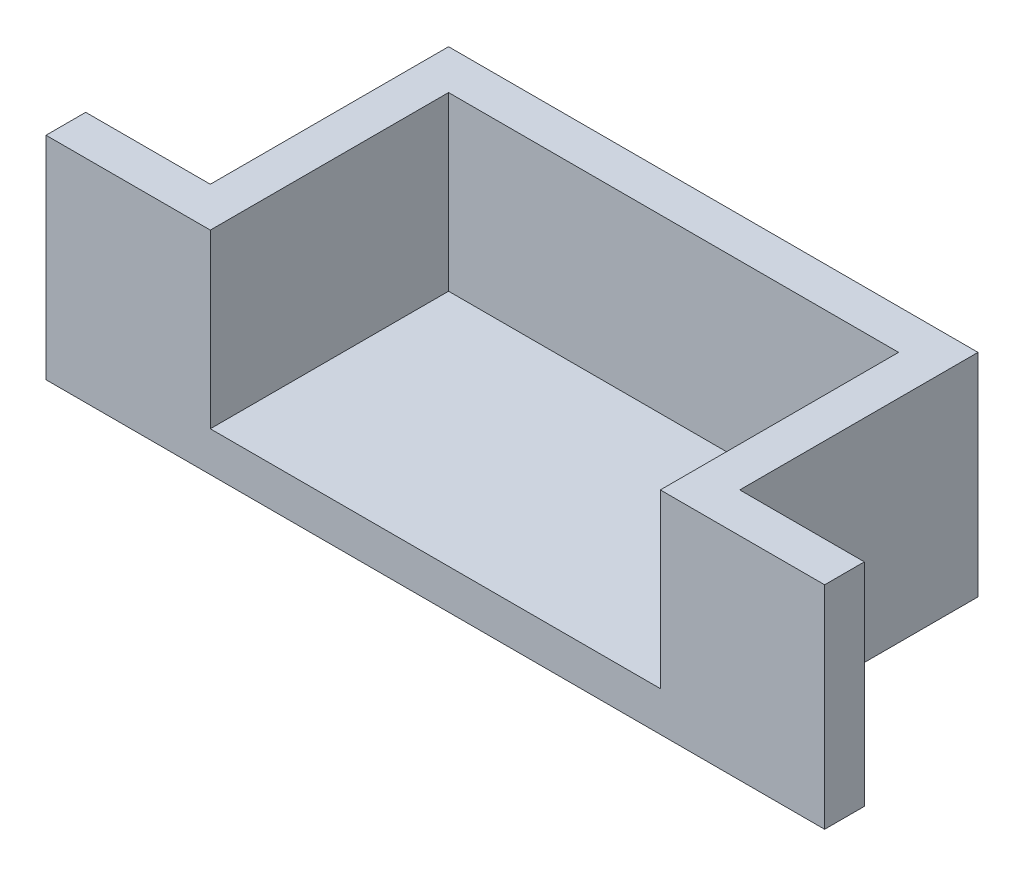
ISO-10303-21;
HEADER;
FILE_DESCRIPTION(('STEP AP214'),'2;1');
FILE_NAME('part.step','',(''),(''),'','','');
FILE_SCHEMA(('AUTOMOTIVE_DESIGN { 1 0 10303 214 1 1 1 1 }'));
ENDSEC;
DATA;
#1=APPLICATION_CONTEXT('core data for automotive mechanical design processes');
#2=APPLICATION_PROTOCOL_DEFINITION('international standard','automotive_design',2000,#1);
#3=PRODUCT_CONTEXT('',#1,'mechanical');
#4=PRODUCT('Part','Part','',(#3));
#5=PRODUCT_RELATED_PRODUCT_CATEGORY('part','',(#4));
#6=PRODUCT_DEFINITION_FORMATION('','',#4);
#7=PRODUCT_DEFINITION_CONTEXT('part definition',#1,'design');
#8=PRODUCT_DEFINITION('design','',#6,#7);
#9=PRODUCT_DEFINITION_SHAPE('','',#8);
#10=(LENGTH_UNIT() NAMED_UNIT(*) SI_UNIT(.MILLI.,.METRE.));
#11=(NAMED_UNIT(*) PLANE_ANGLE_UNIT() SI_UNIT($,.RADIAN.));
#12=(NAMED_UNIT(*) SI_UNIT($,.STERADIAN.) SOLID_ANGLE_UNIT());
#13=UNCERTAINTY_MEASURE_WITH_UNIT(LENGTH_MEASURE(1.E-05),#10,'distance_accuracy_value','');
#14=(GEOMETRIC_REPRESENTATION_CONTEXT(3) GLOBAL_UNCERTAINTY_ASSIGNED_CONTEXT((#13)) GLOBAL_UNIT_ASSIGNED_CONTEXT((#10,
#11,#12)) REPRESENTATION_CONTEXT('',''));
#15=CARTESIAN_POINT('',(0.,0.,0.));
#16=DIRECTION('',(0.,0.,1.));
#17=DIRECTION('',(1.,0.,0.));
#18=AXIS2_PLACEMENT_3D('',#15,#16,#17);
#19=CARTESIAN_POINT('',(-17.,16.,0.));
#20=DIRECTION('',(1.,0.,0.));
#21=DIRECTION('',(0.,0.,-1.));
#22=AXIS2_PLACEMENT_3D('',#19,#20,#21);
#23=PLANE('',#22);
#24=DIRECTION('',(0.,0.,1.));
#25=VECTOR('',#24,1.);
#26=CARTESIAN_POINT('',(-17.,3.,-4.94252873563218));
#27=LINE('',#26,#25);
#28=CARTESIAN_POINT('',(-17.,3.,-4.94252873563218));
#29=VERTEX_POINT('',#28);
#30=CARTESIAN_POINT('',(-17.,3.,13.0574712643678));
#31=VERTEX_POINT('',#30);
#32=EDGE_CURVE('E59',#29,#31,#27,.T.);
#33=ORIENTED_EDGE('',*,*,#32,.F.);
#34=DIRECTION('',(0.,-1.,0.));
#35=VECTOR('',#34,1.);
#36=CARTESIAN_POINT('',(-17.,16.,-4.94252873563218));
#37=LINE('',#36,#35);
#38=CARTESIAN_POINT('',(-17.,16.,-4.94252873563218));
#39=VERTEX_POINT('',#38);
#40=EDGE_CURVE('E11',#39,#29,#37,.T.);
#41=ORIENTED_EDGE('',*,*,#40,.F.);
#42=DIRECTION('',(0.,0.,1.));
#43=VECTOR('',#42,1.);
#44=CARTESIAN_POINT('',(-17.,16.,0.));
#45=LINE('',#44,#43);
#46=CARTESIAN_POINT('',(-17.,16.,13.0574712643678));
#47=VERTEX_POINT('',#46);
#48=EDGE_CURVE('E133',#39,#47,#45,.T.);
#49=ORIENTED_EDGE('',*,*,#48,.T.);
#50=DIRECTION('',(0.,-1.,0.));
#51=VECTOR('',#50,1.);
#52=CARTESIAN_POINT('',(-17.,16.,13.0574712643678));
#53=LINE('',#52,#51);
#54=EDGE_CURVE('E174',#47,#31,#53,.T.);
#55=ORIENTED_EDGE('',*,*,#54,.T.);
#56=EDGE_LOOP('',(#33,#41,#49,#55));
#57=FACE_BOUND('',#56,.T.);
#58=ADVANCED_FACE('F45',(#57),#23,.T.);
#59=CARTESIAN_POINT('',(0.,16.,-4.94252873563218));
#60=DIRECTION('',(0.,0.,-1.));
#61=DIRECTION('',(-1.,0.,0.));
#62=AXIS2_PLACEMENT_3D('',#59,#60,#61);
#63=PLANE('',#62);
#64=ORIENTED_EDGE('',*,*,#40,.T.);
#65=DIRECTION('',(-1.,0.,0.));
#66=VECTOR('',#65,1.);
#67=CARTESIAN_POINT('',(-17.,3.,-4.94252873563218));
#68=LINE('',#67,#66);
#69=CARTESIAN_POINT('',(17.,3.,-4.94252873563218));
#70=VERTEX_POINT('',#69);
#71=EDGE_CURVE('E65',#70,#29,#68,.T.);
#72=ORIENTED_EDGE('',*,*,#71,.F.);
#73=DIRECTION('',(0.,-1.,0.));
#74=VECTOR('',#73,1.);
#75=CARTESIAN_POINT('',(17.,16.,-4.94252873563218));
#76=LINE('',#75,#74);
#77=CARTESIAN_POINT('',(17.,16.,-4.94252873563218));
#78=VERTEX_POINT('',#77);
#79=EDGE_CURVE('E52',#78,#70,#76,.T.);
#80=ORIENTED_EDGE('',*,*,#79,.F.);
#81=DIRECTION('',(1.,0.,0.));
#82=VECTOR('',#81,1.);
#83=CARTESIAN_POINT('',(0.,16.,-4.94252873563218));
#84=LINE('',#83,#82);
#85=EDGE_CURVE('E135',#39,#78,#84,.T.);
#86=ORIENTED_EDGE('',*,*,#85,.F.);
#87=EDGE_LOOP('',(#64,#72,#80,#86));
#88=FACE_BOUND('',#87,.T.);
#89=ADVANCED_FACE('F136',(#88),#63,.F.);
#90=CARTESIAN_POINT('',(17.,16.,0.));
#91=DIRECTION('',(1.,0.,0.));
#92=DIRECTION('',(0.,0.,-1.));
#93=AXIS2_PLACEMENT_3D('',#90,#91,#92);
#94=PLANE('',#93);
#95=ORIENTED_EDGE('',*,*,#79,.T.);
#96=DIRECTION('',(0.,0.,-1.));
#97=VECTOR('',#96,1.);
#98=CARTESIAN_POINT('',(17.,3.,-4.94252873563218));
#99=LINE('',#98,#97);
#100=CARTESIAN_POINT('',(17.,3.,13.0574712643678));
#101=VERTEX_POINT('',#100);
#102=EDGE_CURVE('E219',#101,#70,#99,.T.);
#103=ORIENTED_EDGE('',*,*,#102,.F.);
#104=DIRECTION('',(0.,-1.,0.));
#105=VECTOR('',#104,1.);
#106=CARTESIAN_POINT('',(17.,16.,13.0574712643678));
#107=LINE('',#106,#105);
#108=CARTESIAN_POINT('',(17.,16.,13.0574712643678));
#109=VERTEX_POINT('',#108);
#110=EDGE_CURVE('E213',#109,#101,#107,.T.);
#111=ORIENTED_EDGE('',*,*,#110,.F.);
#112=DIRECTION('',(0.,0.,1.));
#113=VECTOR('',#112,1.);
#114=CARTESIAN_POINT('',(17.,16.,0.));
#115=LINE('',#114,#113);
#116=EDGE_CURVE('E139',#78,#109,#115,.T.);
#117=ORIENTED_EDGE('',*,*,#116,.F.);
#118=EDGE_LOOP('',(#95,#103,#111,#117));
#119=FACE_BOUND('',#118,.T.);
#120=ADVANCED_FACE('F217',(#119),#94,.F.);
#121=CARTESIAN_POINT('',(29.4137931034483,16.,0.));
#122=DIRECTION('',(1.,0.,0.));
#123=DIRECTION('',(0.,0.,-1.));
#124=AXIS2_PLACEMENT_3D('',#121,#122,#123);
#125=PLANE('',#124);
#126=DIRECTION('',(0.,0.,1.));
#127=VECTOR('',#126,1.);
#128=CARTESIAN_POINT('',(29.4137931034483,0.,0.));
#129=LINE('',#128,#127);
#130=CARTESIAN_POINT('',(29.4137931034483,0.,10.0574712643678));
#131=VERTEX_POINT('',#130);
#132=CARTESIAN_POINT('',(29.4137931034483,0.,13.0574712643678));
#133=VERTEX_POINT('',#132);
#134=EDGE_CURVE('E175',#131,#133,#129,.T.);
#135=ORIENTED_EDGE('',*,*,#134,.F.);
#136=DIRECTION('',(0.,-1.,0.));
#137=VECTOR('',#136,1.);
#138=CARTESIAN_POINT('',(29.4137931034483,16.,10.0574712643678));
#139=LINE('',#138,#137);
#140=CARTESIAN_POINT('',(29.4137931034483,16.,10.0574712643678));
#141=VERTEX_POINT('',#140);
#142=EDGE_CURVE('E208',#141,#131,#139,.T.);
#143=ORIENTED_EDGE('',*,*,#142,.F.);
#144=DIRECTION('',(0.,0.,1.));
#145=VECTOR('',#144,1.);
#146=CARTESIAN_POINT('',(29.4137931034483,16.,0.));
#147=LINE('',#146,#145);
#148=CARTESIAN_POINT('',(29.4137931034483,16.,13.0574712643678));
#149=VERTEX_POINT('',#148);
#150=EDGE_CURVE('E155',#141,#149,#147,.T.);
#151=ORIENTED_EDGE('',*,*,#150,.T.);
#152=DIRECTION('',(0.,-1.,0.));
#153=VECTOR('',#152,1.);
#154=CARTESIAN_POINT('',(29.4137931034483,16.,13.0574712643678));
#155=LINE('',#154,#153);
#156=EDGE_CURVE('E210',#149,#133,#155,.T.);
#157=ORIENTED_EDGE('',*,*,#156,.T.);
#158=EDGE_LOOP('',(#135,#143,#151,#157));
#159=FACE_BOUND('',#158,.T.);
#160=ADVANCED_FACE('F262',(#159),#125,.T.);
#161=CARTESIAN_POINT('',(0.,16.,10.0574712643678));
#162=DIRECTION('',(0.,0.,-1.));
#163=DIRECTION('',(-1.,0.,0.));
#164=AXIS2_PLACEMENT_3D('',#161,#162,#163);
#165=PLANE('',#164);
#166=DIRECTION('',(1.,0.,0.));
#167=VECTOR('',#166,1.);
#168=CARTESIAN_POINT('',(0.,0.,10.0574712643678));
#169=LINE('',#168,#167);
#170=CARTESIAN_POINT('',(20.,0.,10.0574712643678));
#171=VERTEX_POINT('',#170);
#172=EDGE_CURVE('E178',#171,#131,#169,.T.);
#173=ORIENTED_EDGE('',*,*,#172,.F.);
#174=DIRECTION('',(0.,-1.,0.));
#175=VECTOR('',#174,1.);
#176=CARTESIAN_POINT('',(20.,16.,10.0574712643678));
#177=LINE('',#176,#175);
#178=CARTESIAN_POINT('',(20.,16.,10.0574712643678));
#179=VERTEX_POINT('',#178);
#180=EDGE_CURVE('E206',#179,#171,#177,.T.);
#181=ORIENTED_EDGE('',*,*,#180,.F.);
#182=DIRECTION('',(1.,0.,0.));
#183=VECTOR('',#182,1.);
#184=CARTESIAN_POINT('',(0.,16.,10.0574712643678));
#185=LINE('',#184,#183);
#186=EDGE_CURVE('E158',#179,#141,#185,.T.);
#187=ORIENTED_EDGE('',*,*,#186,.T.);
#188=ORIENTED_EDGE('',*,*,#142,.T.);
#189=EDGE_LOOP('',(#173,#181,#187,#188));
#190=FACE_BOUND('',#189,.T.);
#191=ADVANCED_FACE('F237',(#190),#165,.T.);
#192=CARTESIAN_POINT('',(20.,16.,0.));
#193=DIRECTION('',(1.,0.,0.));
#194=DIRECTION('',(0.,0.,-1.));
#195=AXIS2_PLACEMENT_3D('',#192,#193,#194);
#196=PLANE('',#195);
#197=DIRECTION('',(0.,0.,1.));
#198=VECTOR('',#197,1.);
#199=CARTESIAN_POINT('',(20.,0.,0.));
#200=LINE('',#199,#198);
#201=CARTESIAN_POINT('',(20.,0.,-7.94252873563218));
#202=VERTEX_POINT('',#201);
#203=EDGE_CURVE('E181',#202,#171,#200,.T.);
#204=ORIENTED_EDGE('',*,*,#203,.F.);
#205=DIRECTION('',(0.,-1.,0.));
#206=VECTOR('',#205,1.);
#207=CARTESIAN_POINT('',(20.,16.,-7.94252873563218));
#208=LINE('',#207,#206);
#209=CARTESIAN_POINT('',(20.,16.,-7.94252873563218));
#210=VERTEX_POINT('',#209);
#211=EDGE_CURVE('E204',#210,#202,#208,.T.);
#212=ORIENTED_EDGE('',*,*,#211,.F.);
#213=DIRECTION('',(0.,0.,1.));
#214=VECTOR('',#213,1.);
#215=CARTESIAN_POINT('',(20.,16.,0.));
#216=LINE('',#215,#214);
#217=EDGE_CURVE('E161',#210,#179,#216,.T.);
#218=ORIENTED_EDGE('',*,*,#217,.T.);
#219=ORIENTED_EDGE('',*,*,#180,.T.);
#220=EDGE_LOOP('',(#204,#212,#218,#219));
#221=FACE_BOUND('',#220,.T.);
#222=ADVANCED_FACE('F241',(#221),#196,.T.);
#223=CARTESIAN_POINT('',(0.,16.,-7.94252873563218));
#224=DIRECTION('',(0.,0.,-1.));
#225=DIRECTION('',(-1.,0.,0.));
#226=AXIS2_PLACEMENT_3D('',#223,#224,#225);
#227=PLANE('',#226);
#228=DIRECTION('',(1.,0.,0.));
#229=VECTOR('',#228,1.);
#230=CARTESIAN_POINT('',(0.,0.,-7.94252873563218));
#231=LINE('',#230,#229);
#232=CARTESIAN_POINT('',(-20.,0.,-7.94252873563218));
#233=VERTEX_POINT('',#232);
#234=EDGE_CURVE('E184',#233,#202,#231,.T.);
#235=ORIENTED_EDGE('',*,*,#234,.F.);
#236=DIRECTION('',(0.,-1.,0.));
#237=VECTOR('',#236,1.);
#238=CARTESIAN_POINT('',(-20.,16.,-7.94252873563218));
#239=LINE('',#238,#237);
#240=CARTESIAN_POINT('',(-20.,16.,-7.94252873563218));
#241=VERTEX_POINT('',#240);
#242=EDGE_CURVE('E202',#241,#233,#239,.T.);
#243=ORIENTED_EDGE('',*,*,#242,.F.);
#244=DIRECTION('',(1.,0.,0.));
#245=VECTOR('',#244,1.);
#246=CARTESIAN_POINT('',(0.,16.,-7.94252873563218));
#247=LINE('',#246,#245);
#248=EDGE_CURVE('E164',#241,#210,#247,.T.);
#249=ORIENTED_EDGE('',*,*,#248,.T.);
#250=ORIENTED_EDGE('',*,*,#211,.T.);
#251=EDGE_LOOP('',(#235,#243,#249,#250));
#252=FACE_BOUND('',#251,.T.);
#253=ADVANCED_FACE('F245',(#252),#227,.T.);
#254=CARTESIAN_POINT('',(-20.,16.,0.));
#255=DIRECTION('',(1.,0.,0.));
#256=DIRECTION('',(0.,0.,-1.));
#257=AXIS2_PLACEMENT_3D('',#254,#255,#256);
#258=PLANE('',#257);
#259=DIRECTION('',(0.,0.,1.));
#260=VECTOR('',#259,1.);
#261=CARTESIAN_POINT('',(-20.,0.,0.));
#262=LINE('',#261,#260);
#263=CARTESIAN_POINT('',(-20.,0.,10.0574712643678));
#264=VERTEX_POINT('',#263);
#265=EDGE_CURVE('E187',#233,#264,#262,.T.);
#266=ORIENTED_EDGE('',*,*,#265,.T.);
#267=DIRECTION('',(0.,-1.,0.));
#268=VECTOR('',#267,1.);
#269=CARTESIAN_POINT('',(-20.,16.,10.0574712643678));
#270=LINE('',#269,#268);
#271=CARTESIAN_POINT('',(-20.,16.,10.0574712643678));
#272=VERTEX_POINT('',#271);
#273=EDGE_CURVE('E199',#272,#264,#270,.T.);
#274=ORIENTED_EDGE('',*,*,#273,.F.);
#275=DIRECTION('',(0.,0.,1.));
#276=VECTOR('',#275,1.);
#277=CARTESIAN_POINT('',(-20.,16.,0.));
#278=LINE('',#277,#276);
#279=EDGE_CURVE('E167',#241,#272,#278,.T.);
#280=ORIENTED_EDGE('',*,*,#279,.F.);
#281=ORIENTED_EDGE('',*,*,#242,.T.);
#282=EDGE_LOOP('',(#266,#274,#280,#281));
#283=FACE_BOUND('',#282,.T.);
#284=ADVANCED_FACE('F250',(#283),#258,.F.);
#285=CARTESIAN_POINT('',(0.,16.,10.0574712643678));
#286=DIRECTION('',(0.,0.,1.));
#287=DIRECTION('',(1.,0.,0.));
#288=AXIS2_PLACEMENT_3D('',#285,#286,#287);
#289=PLANE('',#288);
#290=DIRECTION('',(-1.,0.,0.));
#291=VECTOR('',#290,1.);
#292=CARTESIAN_POINT('',(0.,0.,10.0574712643678));
#293=LINE('',#292,#291);
#294=CARTESIAN_POINT('',(-29.4137931034483,0.,10.0574712643678));
#295=VERTEX_POINT('',#294);
#296=EDGE_CURVE('E189',#264,#295,#293,.T.);
#297=ORIENTED_EDGE('',*,*,#296,.T.);
#298=DIRECTION('',(0.,-1.,0.));
#299=VECTOR('',#298,1.);
#300=CARTESIAN_POINT('',(-29.4137931034483,16.,10.0574712643678));
#301=LINE('',#300,#299);
#302=CARTESIAN_POINT('',(-29.4137931034483,16.,10.0574712643678));
#303=VERTEX_POINT('',#302);
#304=EDGE_CURVE('E196',#303,#295,#301,.T.);
#305=ORIENTED_EDGE('',*,*,#304,.F.);
#306=DIRECTION('',(-1.,0.,0.));
#307=VECTOR('',#306,1.);
#308=CARTESIAN_POINT('',(0.,16.,10.0574712643678));
#309=LINE('',#308,#307);
#310=EDGE_CURVE('E169',#272,#303,#309,.T.);
#311=ORIENTED_EDGE('',*,*,#310,.F.);
#312=ORIENTED_EDGE('',*,*,#273,.T.);
#313=EDGE_LOOP('',(#297,#305,#311,#312));
#314=FACE_BOUND('',#313,.T.);
#315=ADVANCED_FACE('F256',(#314),#289,.F.);
#316=CARTESIAN_POINT('',(-29.4137931034483,16.,0.));
#317=DIRECTION('',(1.,0.,0.));
#318=DIRECTION('',(0.,0.,-1.));
#319=AXIS2_PLACEMENT_3D('',#316,#317,#318);
#320=PLANE('',#319);
#321=DIRECTION('',(0.,0.,1.));
#322=VECTOR('',#321,1.);
#323=CARTESIAN_POINT('',(-29.4137931034483,0.,0.));
#324=LINE('',#323,#322);
#325=CARTESIAN_POINT('',(-29.4137931034483,0.,13.0574712643678));
#326=VERTEX_POINT('',#325);
#327=EDGE_CURVE('E147',#295,#326,#324,.T.);
#328=ORIENTED_EDGE('',*,*,#327,.T.);
#329=DIRECTION('',(0.,-1.,0.));
#330=VECTOR('',#329,1.);
#331=CARTESIAN_POINT('',(-29.4137931034483,16.,13.0574712643678));
#332=LINE('',#331,#330);
#333=CARTESIAN_POINT('',(-29.4137931034483,16.,13.0574712643678));
#334=VERTEX_POINT('',#333);
#335=EDGE_CURVE('E194',#334,#326,#332,.T.);
#336=ORIENTED_EDGE('',*,*,#335,.F.);
#337=DIRECTION('',(0.,0.,1.));
#338=VECTOR('',#337,1.);
#339=CARTESIAN_POINT('',(-29.4137931034483,16.,0.));
#340=LINE('',#339,#338);
#341=EDGE_CURVE('E171',#303,#334,#340,.T.);
#342=ORIENTED_EDGE('',*,*,#341,.F.);
#343=ORIENTED_EDGE('',*,*,#304,.T.);
#344=EDGE_LOOP('',(#328,#336,#342,#343));
#345=FACE_BOUND('',#344,.T.);
#346=ADVANCED_FACE('F260',(#345),#320,.F.);
#347=CARTESIAN_POINT('',(0.,16.,13.0574712643678));
#348=DIRECTION('',(0.,0.,1.));
#349=DIRECTION('',(1.,0.,0.));
#350=AXIS2_PLACEMENT_3D('',#347,#348,#349);
#351=PLANE('',#350);
#352=DIRECTION('',(-1.,0.,0.));
#353=VECTOR('',#352,1.);
#354=CARTESIAN_POINT('',(0.,0.,13.0574712643678));
#355=LINE('',#354,#353);
#356=EDGE_CURVE('E144',#133,#326,#355,.T.);
#357=ORIENTED_EDGE('',*,*,#356,.F.);
#358=ORIENTED_EDGE('',*,*,#156,.F.);
#359=DIRECTION('',(1.,0.,0.));
#360=VECTOR('',#359,1.);
#361=CARTESIAN_POINT('',(0.,16.,13.0574712643678));
#362=LINE('',#361,#360);
#363=EDGE_CURVE('E153',#109,#149,#362,.T.);
#364=ORIENTED_EDGE('',*,*,#363,.F.);
#365=ORIENTED_EDGE('',*,*,#110,.T.);
#366=DIRECTION('',(1.,0.,0.));
#367=VECTOR('',#366,1.);
#368=CARTESIAN_POINT('',(-17.,3.,13.0574712643678));
#369=LINE('',#368,#367);
#370=EDGE_CURVE('E224',#31,#101,#369,.T.);
#371=ORIENTED_EDGE('',*,*,#370,.F.);
#372=ORIENTED_EDGE('',*,*,#54,.F.);
#373=DIRECTION('',(-1.,0.,0.));
#374=VECTOR('',#373,1.);
#375=CARTESIAN_POINT('',(0.,16.,13.0574712643678));
#376=LINE('',#375,#374);
#377=EDGE_CURVE('E143',#47,#334,#376,.T.);
#378=ORIENTED_EDGE('',*,*,#377,.T.);
#379=ORIENTED_EDGE('',*,*,#335,.T.);
#380=EDGE_LOOP('',(#357,#358,#364,#365,#371,#372,#378,#379));
#381=FACE_BOUND('',#380,.T.);
#382=ADVANCED_FACE('F228',(#381),#351,.T.);
#383=CARTESIAN_POINT('',(0.,16.,0.));
#384=DIRECTION('',(0.,1.,0.));
#385=DIRECTION('',(0.,0.,1.));
#386=AXIS2_PLACEMENT_3D('',#383,#384,#385);
#387=PLANE('',#386);
#388=ORIENTED_EDGE('',*,*,#48,.F.);
#389=ORIENTED_EDGE('',*,*,#85,.T.);
#390=ORIENTED_EDGE('',*,*,#116,.T.);
#391=ORIENTED_EDGE('',*,*,#363,.T.);
#392=ORIENTED_EDGE('',*,*,#150,.F.);
#393=ORIENTED_EDGE('',*,*,#186,.F.);
#394=ORIENTED_EDGE('',*,*,#217,.F.);
#395=ORIENTED_EDGE('',*,*,#248,.F.);
#396=ORIENTED_EDGE('',*,*,#279,.T.);
#397=ORIENTED_EDGE('',*,*,#310,.T.);
#398=ORIENTED_EDGE('',*,*,#341,.T.);
#399=ORIENTED_EDGE('',*,*,#377,.F.);
#400=EDGE_LOOP('',(#388,#389,#390,#391,#392,#393,#394,#395,#396,#397,#398,#399));
#401=FACE_BOUND('',#400,.T.);
#402=ADVANCED_FACE('F141',(#401),#387,.T.);
#403=CARTESIAN_POINT('',(0.,0.,0.));
#404=DIRECTION('',(0.,1.,0.));
#405=DIRECTION('',(0.,0.,1.));
#406=AXIS2_PLACEMENT_3D('',#403,#404,#405);
#407=PLANE('',#406);
#408=ORIENTED_EDGE('',*,*,#134,.T.);
#409=ORIENTED_EDGE('',*,*,#356,.T.);
#410=ORIENTED_EDGE('',*,*,#327,.F.);
#411=ORIENTED_EDGE('',*,*,#296,.F.);
#412=ORIENTED_EDGE('',*,*,#265,.F.);
#413=ORIENTED_EDGE('',*,*,#234,.T.);
#414=ORIENTED_EDGE('',*,*,#203,.T.);
#415=ORIENTED_EDGE('',*,*,#172,.T.);
#416=EDGE_LOOP('',(#408,#409,#410,#411,#412,#413,#414,#415));
#417=FACE_BOUND('',#416,.T.);
#418=ADVANCED_FACE('F263',(#417),#407,.F.);
#419=CARTESIAN_POINT('',(0.,3.,0.));
#420=DIRECTION('',(0.,1.,0.));
#421=DIRECTION('',(0.,0.,1.));
#422=AXIS2_PLACEMENT_3D('',#419,#420,#421);
#423=PLANE('',#422);
#424=ORIENTED_EDGE('',*,*,#32,.T.);
#425=ORIENTED_EDGE('',*,*,#370,.T.);
#426=ORIENTED_EDGE('',*,*,#102,.T.);
#427=ORIENTED_EDGE('',*,*,#71,.T.);
#428=EDGE_LOOP('',(#424,#425,#426,#427));
#429=FACE_BOUND('',#428,.T.);
#430=ADVANCED_FACE('F222',(#429),#423,.T.);
#431=CLOSED_SHELL('',(#58,#89,#120,#160,#191,#222,#253,#284,#315,#346,#382,#402,#418,#430));
#432=MANIFOLD_SOLID_BREP('B2',#431);
#433=ADVANCED_BREP_SHAPE_REPRESENTATION('',(#18,#432),#14);
#434=SHAPE_DEFINITION_REPRESENTATION(#9,#433);
ENDSEC;
END-ISO-10303-21;
